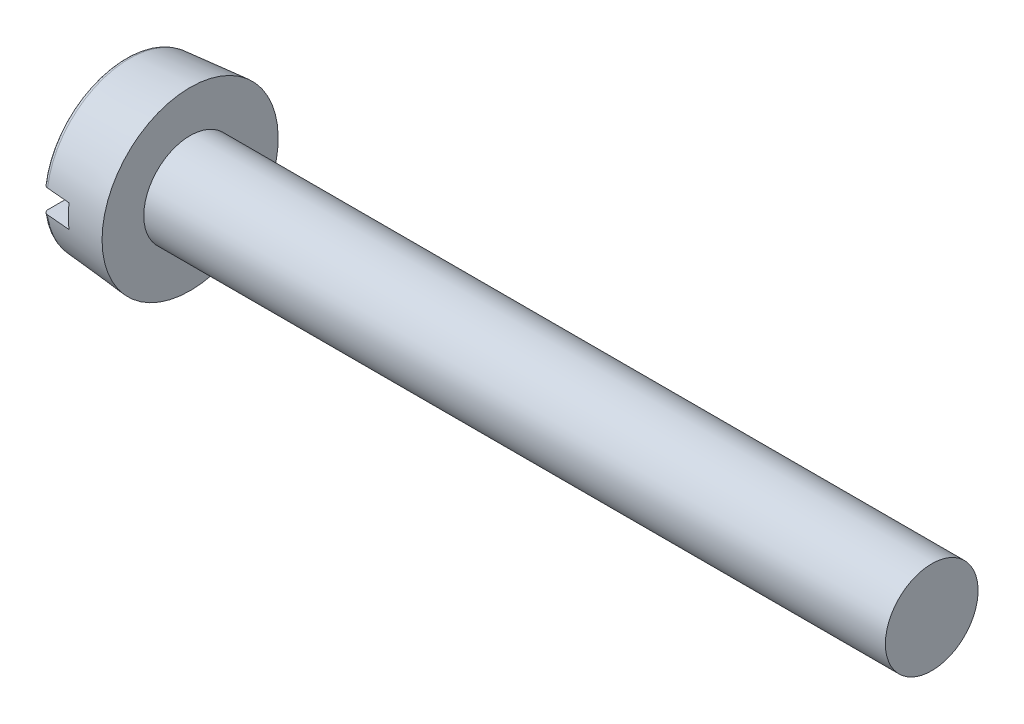
ISO-10303-21;
HEADER;
FILE_DESCRIPTION(('STEP AP214'),'2;1');
FILE_NAME('part.step','',(''),(''),'','','');
FILE_SCHEMA(('AUTOMOTIVE_DESIGN { 1 0 10303 214 1 1 1 1 }'));
ENDSEC;
DATA;
#1=APPLICATION_CONTEXT('core data for automotive mechanical design processes');
#2=APPLICATION_PROTOCOL_DEFINITION('international standard','automotive_design',2000,#1);
#3=PRODUCT_CONTEXT('',#1,'mechanical');
#4=PRODUCT('Part','Part','',(#3));
#5=PRODUCT_RELATED_PRODUCT_CATEGORY('part','',(#4));
#6=PRODUCT_DEFINITION_FORMATION('','',#4);
#7=PRODUCT_DEFINITION_CONTEXT('part definition',#1,'design');
#8=PRODUCT_DEFINITION('design','',#6,#7);
#9=PRODUCT_DEFINITION_SHAPE('','',#8);
#10=(LENGTH_UNIT() NAMED_UNIT(*) SI_UNIT(.MILLI.,.METRE.));
#11=(NAMED_UNIT(*) PLANE_ANGLE_UNIT() SI_UNIT($,.RADIAN.));
#12=(NAMED_UNIT(*) SI_UNIT($,.STERADIAN.) SOLID_ANGLE_UNIT());
#13=UNCERTAINTY_MEASURE_WITH_UNIT(LENGTH_MEASURE(1.E-05),#10,'distance_accuracy_value','');
#14=(GEOMETRIC_REPRESENTATION_CONTEXT(3) GLOBAL_UNCERTAINTY_ASSIGNED_CONTEXT((#13)) GLOBAL_UNIT_ASSIGNED_CONTEXT((#10,
#11,#12)) REPRESENTATION_CONTEXT('',''));
#15=CARTESIAN_POINT('',(0.,0.,0.));
#16=DIRECTION('',(0.,0.,1.));
#17=DIRECTION('',(1.,0.,0.));
#18=AXIS2_PLACEMENT_3D('',#15,#16,#17);
#19=CARTESIAN_POINT('',(0.,0.,0.));
#20=DIRECTION('',(-1.,0.,0.));
#21=DIRECTION('',(0.,0.,1.));
#22=AXIS2_PLACEMENT_3D('',#19,#20,#21);
#23=PLANE('',#22);
#24=DIRECTION('',(0.,0.,-1.));
#25=VECTOR('',#24,1.);
#26=CARTESIAN_POINT('',(0.,0.25,1.9));
#27=LINE('',#26,#25);
#28=CARTESIAN_POINT('',(0.,0.25,1.66724343126457));
#29=VERTEX_POINT('',#28);
#30=CARTESIAN_POINT('',(0.,0.25,-1.66724343126457));
#31=VERTEX_POINT('',#30);
#32=EDGE_CURVE('E103',#29,#31,#27,.T.);
#33=ORIENTED_EDGE('',*,*,#32,.F.);
#34=CARTESIAN_POINT('',(0.,0.,0.));
#35=DIRECTION('',(-1.,0.,0.));
#36=DIRECTION('',(0.,0.,1.));
#37=AXIS2_PLACEMENT_3D('',#34,#35,#36);
#38=CIRCLE('',#37,1.68588275366196);
#39=EDGE_CURVE('E105',#29,#31,#38,.T.);
#40=ORIENTED_EDGE('',*,*,#39,.T.);
#41=EDGE_LOOP('',(#33,#40));
#42=FACE_BOUND('',#41,.T.);
#43=ADVANCED_FACE('F35',(#42),#23,.T.);
#44=CARTESIAN_POINT('',(0.1,0.,0.));
#45=DIRECTION('',(-1.,0.,0.));
#46=DIRECTION('',(0.,0.,1.));
#47=AXIS2_PLACEMENT_3D('',#44,#45,#46);
#48=TOROIDAL_SURFACE('',#47,1.68588275366196,0.1);
#49=CARTESIAN_POINT('',(0.0301239837184526,0.25,-1.73954570987134));
#50=CARTESIAN_POINT('',(0.034112254025655,0.25,-1.74348114703534));
#51=CARTESIAN_POINT('',(0.0384332916495908,0.25,-1.74708479745269));
#52=CARTESIAN_POINT('',(0.047621596888568,0.25,-1.75351988324919));
#53=CARTESIAN_POINT('',(0.0524894518418904,0.25,-1.75635047687334));
#54=CARTESIAN_POINT('',(0.062632126905778,0.25,-1.7611518726827));
#55=CARTESIAN_POINT('',(0.0679068945512788,0.25,-1.76312278549305));
#56=CARTESIAN_POINT('',(0.0787122454713205,0.25,-1.76614517825523));
#57=CARTESIAN_POINT('',(0.0842427666888278,0.25,-1.76719688002821));
#58=CARTESIAN_POINT('',(0.095373394443947,0.25,-1.76834695503076));
#59=CARTESIAN_POINT('',(0.100972999637236,0.25,-1.76845018239128));
#60=CARTESIAN_POINT('',(0.112109811915657,0.25,-1.76771285537891));
#61=CARTESIAN_POINT('',(0.117647018058241,0.25,-1.76687228676909));
#62=CARTESIAN_POINT('',(0.128489803717952,0.25,-1.76427538353904));
#63=CARTESIAN_POINT('',(0.133795848010852,0.25,-1.76252098799906));
#64=CARTESIAN_POINT('',(0.144039730319539,0.25,-1.75814968615088));
#65=CARTESIAN_POINT('',(0.148977564711526,0.25,-1.75553277135543));
#66=CARTESIAN_POINT('',(0.15836674169469,0.25,-1.74950124280131));
#67=CARTESIAN_POINT('',(0.162816088565464,0.25,-1.74608352334629));
#68=CARTESIAN_POINT('',(0.171083921068067,0.25,-1.73855542384798));
#69=CARTESIAN_POINT('',(0.174902382724925,0.25,-1.73444501749311));
#70=CARTESIAN_POINT('',(0.181835504151915,0.25,-1.72561114445745));
#71=CARTESIAN_POINT('',(0.184943867145123,0.25,-1.72088273649891));
#72=CARTESIAN_POINT('',(0.190331805109598,0.25,-1.71097526726483));
#73=CARTESIAN_POINT('',(0.19261133485436,0.25,-1.7057961814165));
#74=CARTESIAN_POINT('',(0.196300503462131,0.25,-1.69507883946751));
#75=CARTESIAN_POINT('',(0.197701208750648,0.25,-1.68953750769915));
#76=CARTESIAN_POINT('',(0.199560107931746,0.25,-1.67829891478366));
#77=CARTESIAN_POINT('',(0.2000182569785,0.25,-1.67260164623029));
#78=CARTESIAN_POINT('',(0.199980488082452,0.25,-1.66116755240173));
#79=CARTESIAN_POINT('',(0.199477416691625,0.25,-1.65543074959807));
#80=CARTESIAN_POINT('',(0.197516883099685,0.25,-1.64412247089109));
#81=CARTESIAN_POINT('',(0.19605940106392,0.25,-1.6385509984262));
#82=CARTESIAN_POINT('',(0.192226434881595,0.25,-1.62772407078967));
#83=CARTESIAN_POINT('',(0.189849634285873,0.25,-1.62246908134511));
#84=CARTESIAN_POINT('',(0.184242507962168,0.25,-1.61243590232117));
#85=CARTESIAN_POINT('',(0.181012200803495,0.25,-1.60765770237164));
#86=CARTESIAN_POINT('',(0.173808398364609,0.25,-1.59874552852762));
#87=CARTESIAN_POINT('',(0.16983941365434,0.25,-1.5946079100141));
#88=CARTESIAN_POINT('',(0.161256212040593,0.25,-1.58706689346002));
#89=CARTESIAN_POINT('',(0.156642033668647,0.25,-1.58366345160461));
#90=CARTESIAN_POINT('',(0.146954193747203,0.25,-1.577728304209));
#91=CARTESIAN_POINT('',(0.141886222152689,0.25,-1.57518731173971));
#92=CARTESIAN_POINT('',(0.131392256265676,0.25,-1.57100326499133));
#93=CARTESIAN_POINT('',(0.125966286684049,0.25,-1.5693601488087));
#94=CARTESIAN_POINT('',(0.114975418023078,0.25,-1.56703614777695));
#95=CARTESIAN_POINT('',(0.109412743361664,0.25,-1.56634473553344));
#96=CARTESIAN_POINT('',(0.0982506296477884,0.25,-1.56591134324024));
#97=CARTESIAN_POINT('',(0.0926511921124149,0.25,-1.56616932425487));
#98=CARTESIAN_POINT('',(0.0816068018037831,0.25,-1.56762261837648));
#99=CARTESIAN_POINT('',(0.0761611699810637,0.25,-1.56881278083001));
#100=CARTESIAN_POINT('',(0.0655461187744446,0.25,-1.57208782392461));
#101=CARTESIAN_POINT('',(0.0603767005480557,0.25,-1.5741727083148));
#102=CARTESIAN_POINT('',(0.0504429211594084,0.25,-1.57918218125947));
#103=CARTESIAN_POINT('',(0.0456798188477843,0.25,-1.58210926476463));
#104=CARTESIAN_POINT('',(0.0367063855830663,0.25,-1.58871421123321));
#105=CARTESIAN_POINT('',(0.0324960808997952,0.25,-1.59239210985535));
#106=CARTESIAN_POINT('',(0.0247028499071559,0.25,-1.60043217731811));
#107=CARTESIAN_POINT('',(0.0211264966781283,0.25,-1.60480071638002));
#108=CARTESIAN_POINT('',(0.0147478039662305,0.25,-1.61407035663433));
#109=CARTESIAN_POINT('',(0.0119455146325412,0.25,-1.61897149230335));
#110=CARTESIAN_POINT('',(0.00716047536747477,0.25,-1.62922901712882));
#111=CARTESIAN_POINT('',(0.00518773010061175,0.25,-1.6345900743117));
#112=CARTESIAN_POINT('',(0.00216211004761502,0.25,-1.64556559292559));
#113=CARTESIAN_POINT('',(0.00110924708522794,0.25,-1.6511800576128));
#114=CARTESIAN_POINT('',(-5.33425649794324E-05,0.25,-1.66255157007252));
#115=CARTESIAN_POINT('',(-0.000155417619311267,0.25,-1.6683094013264));
#116=CARTESIAN_POINT('',(0.000607195995681169,0.25,-1.67976235656453));
#117=CARTESIAN_POINT('',(0.00147213868127235,0.25,-1.68545746367547));
#118=CARTESIAN_POINT('',(0.00414869895477062,0.25,-1.69663068032758));
#119=CARTESIAN_POINT('',(0.00596193608673396,0.25,-1.70210840133309));
#120=CARTESIAN_POINT('',(0.0104866705202582,0.25,-1.71267417663621));
#121=CARTESIAN_POINT('',(0.0131970742616454,0.25,-1.71776269608293));
#122=CARTESIAN_POINT('',(0.0183021368753953,0.25,-1.72564874312836));
#123=CARTESIAN_POINT('',(0.0204534266755831,0.25,-1.72860667972899));
#124=CARTESIAN_POINT('',(0.0250639712199923,0.25,-1.73427200964239));
#125=CARTESIAN_POINT('',(0.0275232249959105,0.25,-1.73697940374288));
#126=CARTESIAN_POINT('',(0.0301239837184526,0.25,-1.73954570987134));
#127=B_SPLINE_CURVE_WITH_KNOTS('',3,(#49,#50,#51,#52,#53,#54,#55,#56,#57,#58,#59,#60,#61,#62,
#63,#64,#65,#66,#67,#68,#69,#70,#71,#72,#73,#74,#75,#76,#77,#78,#79,#80,#81,#82,#83,#84,#85,#86,
#87,#88,#89,#90,#91,#92,#93,#94,#95,#96,#97,#98,#99,#100,#101,#102,#103,#104,#105,#106,#107,
#108,#109,#110,#111,#112,#113,#114,#115,#116,#117,#118,#119,#120,#121,#122,#123,#124,#125,#126),
.UNSPECIFIED.,.T.,.F.,(4,2,2,2,2,2,2,2,2,2,2,2,2,2,2,2,2,2,2,2,2,2,2,2,2,2,2,2,2,2,2,2,2,2,2,2,
2,2,4),(0.,0.0167959110445544,0.0336100383184083,0.0504220012837826,0.067229906117249,
0.0839517427346662,0.100673831600298,0.117360580985524,0.13404749457459,0.150800227323111,
0.16755359656452,0.184450209981753,0.201347745249247,0.21841437976708,0.235481826278521,
0.252676784421207,0.269872099922449,0.287092130544962,0.304311786550839,0.321429553193156,
0.338546297983667,0.355472401973108,0.372397338855157,0.389133511649821,0.405868998082989,
0.422512661437951,0.439156394534986,0.455849950224767,0.472544298931969,0.489402732254282,
0.506262257525773,0.523319657239104,0.540377276197228,0.557572051898691,0.574771345386106,
0.59200010906381,0.609207949388039,0.620160629655461,0.631113275486232),.UNSPECIFIED.);
#128=CARTESIAN_POINT('',(0.0912844257252333,0.25,-1.76791351316188));
#129=VERTEX_POINT('',#128);
#130=EDGE_CURVE('E59',#31,#129,#127,.T.);
#131=ORIENTED_EDGE('',*,*,#130,.F.);
#132=ORIENTED_EDGE('',*,*,#39,.F.);
#133=CARTESIAN_POINT('',(0.038410820052543,0.25,1.58753563015566));
#134=CARTESIAN_POINT('',(0.0427902939890951,0.25,1.58407005650774));
#135=CARTESIAN_POINT('',(0.0474630469549886,0.25,1.58096901798645));
#136=CARTESIAN_POINT('',(0.0572657439915521,0.25,1.57559125576911));
#137=CARTESIAN_POINT('',(0.0623961680717351,0.25,1.57331541051488));
#138=CARTESIAN_POINT('',(0.0729671844638347,0.25,1.56966008382672));
#139=CARTESIAN_POINT('',(0.07840774990333,0.25,1.56828052486143));
#140=CARTESIAN_POINT('',(0.0894424523036424,0.25,1.56646066317196));
#141=CARTESIAN_POINT('',(0.095036552043679,0.25,1.56602013480384));
#142=CARTESIAN_POINT('',(0.106187916851424,0.25,1.56609100566934));
#143=CARTESIAN_POINT('',(0.111745215600338,0.25,1.56659719462549));
#144=CARTESIAN_POINT('',(0.122695887603688,0.25,1.56853573821628));
#145=CARTESIAN_POINT('',(0.128089257112213,0.25,1.56996811399837));
#146=CARTESIAN_POINT('',(0.138558934280524,0.25,1.57371510963342));
#147=CARTESIAN_POINT('',(0.143635299693183,0.25,1.57602956823661));
#148=CARTESIAN_POINT('',(0.153331512379459,0.25,1.58147155156435));
#149=CARTESIAN_POINT('',(0.15795134553212,0.25,1.58459910142768));
#150=CARTESIAN_POINT('',(0.166642844689645,0.25,1.59160307133553));
#151=CARTESIAN_POINT('',(0.170709973240091,0.25,1.59548512047214));
#152=CARTESIAN_POINT('',(0.178144005385512,0.25,1.60386991016736));
#153=CARTESIAN_POINT('',(0.181510868111661,0.25,1.6083726869273));
#154=CARTESIAN_POINT('',(0.18749050008726,0.25,1.61792751523025));
#155=CARTESIAN_POINT('',(0.190093987175765,0.25,1.62298537603827));
#156=CARTESIAN_POINT('',(0.1944245750689,0.25,1.63346332336008));
#157=CARTESIAN_POINT('',(0.196151623655146,0.25,1.63888343143487));
#158=CARTESIAN_POINT('',(0.19869656706418,0.25,1.64999030292115));
#159=CARTESIAN_POINT('',(0.19950519348372,0.25,1.65567919157282));
#160=CARTESIAN_POINT('',(0.200160111365204,0.25,1.66711218979157));
#161=CARTESIAN_POINT('',(0.200006372625093,0.25,1.67285630108606));
#162=CARTESIAN_POINT('',(0.198737358913371,0.25,1.68426056047317));
#163=CARTESIAN_POINT('',(0.197618277112314,0.25,1.68992028578478));
#164=CARTESIAN_POINT('',(0.194442698747917,0.25,1.70097049473464));
#165=CARTESIAN_POINT('',(0.192386209487117,0.25,1.70636098046993));
#166=CARTESIAN_POINT('',(0.187399427297266,0.25,1.7166994325418));
#167=CARTESIAN_POINT('',(0.18447206309478,0.25,1.72164881093218));
#168=CARTESIAN_POINT('',(0.177821112560515,0.25,1.7309802162384));
#169=CARTESIAN_POINT('',(0.174097559800523,0.25,1.73536226706347));
#170=CARTESIAN_POINT('',(0.165993769608675,0.25,1.74339353418511));
#171=CARTESIAN_POINT('',(0.161619482864613,0.25,1.74704875411543));
#172=CARTESIAN_POINT('',(0.152314080979336,0.25,1.75356401214195));
#173=CARTESIAN_POINT('',(0.147382997277304,0.25,1.75642409510351));
#174=CARTESIAN_POINT('',(0.137157313470634,0.25,1.76123793804063));
#175=CARTESIAN_POINT('',(0.131866864335231,0.25,1.76320051691167));
#176=CARTESIAN_POINT('',(0.121030177928266,0.25,1.7662021188539));
#177=CARTESIAN_POINT('',(0.115483952770112,0.25,1.76724118561497));
#178=CARTESIAN_POINT('',(0.10433726421861,0.25,1.76836005573213));
#179=CARTESIAN_POINT('',(0.0987375081693258,0.25,1.76844691644335));
#180=CARTESIAN_POINT('',(0.087603319258539,0.25,1.76767711814466));
#181=CARTESIAN_POINT('',(0.0820688850795545,0.25,1.76682047819726));
#182=CARTESIAN_POINT('',(0.0712339359121825,0.25,1.76419215705386));
#183=CARTESIAN_POINT('',(0.0659329644744124,0.25,1.76242235604695));
#184=CARTESIAN_POINT('',(0.0557017028644443,0.25,1.75802135089928));
#185=CARTESIAN_POINT('',(0.0507714167878425,0.25,1.75539013724272));
#186=CARTESIAN_POINT('',(0.0413993898846341,0.25,1.74933132383135));
#187=CARTESIAN_POINT('',(0.0369596773547098,0.25,1.74590058763537));
#188=CARTESIAN_POINT('',(0.0287131089970532,0.25,1.73834824703872));
#189=CARTESIAN_POINT('',(0.0249062794513212,0.25,1.73422661396116));
#190=CARTESIAN_POINT('',(0.0179981143560025,0.25,1.72537218244404));
#191=CARTESIAN_POINT('',(0.0149031090922604,0.25,1.72063444579746));
#192=CARTESIAN_POINT('',(0.00954325096840232,0.25,1.71071066098417));
#193=CARTESIAN_POINT('',(0.00727844426054883,0.25,1.70552458791341));
#194=CARTESIAN_POINT('',(0.00361981721141317,0.25,1.6947956662052));
#195=CARTESIAN_POINT('',(0.00223495300327892,0.25,1.68924976295691));
#196=CARTESIAN_POINT('',(0.000408375366710347,0.25,1.67800493025775));
#197=CARTESIAN_POINT('',(-3.33291319020889E-05,0.25,1.67230599935852));
#198=CARTESIAN_POINT('',(3.75123327412075E-05,0.25,1.66087218591111));
#199=CARTESIAN_POINT('',(0.000557074784948298,0.25,1.65513734594055));
#200=CARTESIAN_POINT('',(0.00255033342308908,0.25,1.64383422369473));
#201=CARTESIAN_POINT('',(0.00402428246581622,0.25,1.63826598596849));
#202=CARTESIAN_POINT('',(0.0078899997087705,0.25,1.62744650084935));
#203=CARTESIAN_POINT('',(0.0102834602468332,0.25,1.62219585873013));
#204=CARTESIAN_POINT('',(0.0159217046243908,0.25,1.61217899485774));
#205=CARTESIAN_POINT('',(0.019165452268333,0.25,1.607412193218));
#206=CARTESIAN_POINT('',(0.0251008031700794,0.25,1.60011257766084));
#207=CARTESIAN_POINT('',(0.0275686339076144,0.25,1.59739475707804));
#208=CARTESIAN_POINT('',(0.0327857649139937,0.25,1.59224410808593));
#209=CARTESIAN_POINT('',(0.0355350642370449,0.25,1.58981127871903));
#210=CARTESIAN_POINT('',(0.038410820052543,0.25,1.58753563015566));
#211=B_SPLINE_CURVE_WITH_KNOTS('',3,(#133,#134,#135,#136,#137,#138,#139,#140,#141,#142,#143,
#144,#145,#146,#147,#148,#149,#150,#151,#152,#153,#154,#155,#156,#157,#158,#159,#160,#161,#162,
#163,#164,#165,#166,#167,#168,#169,#170,#171,#172,#173,#174,#175,#176,#177,#178,#179,#180,#181,
#182,#183,#184,#185,#186,#187,#188,#189,#190,#191,#192,#193,#194,#195,#196,#197,#198,#199,#200,
#201,#202,#203,#204,#205,#206,#207,#208,#209,#210),.UNSPECIFIED.,.T.,.F.,(4,2,2,2,2,2,2,2,2,2,2,
2,2,2,2,2,2,2,2,2,2,2,2,2,2,2,2,2,2,2,2,2,2,2,2,2,2,2,4),(0.,0.0167411910060397,
0.0335001515260866,0.0502576621545582,0.0670111455902061,0.0836726971117883,0.10033462907698,
0.116993516605719,0.133652919247718,0.150441746179846,0.167231552664634,0.184217767175992,
0.201204993610689,0.218362167205906,0.235519879250063,0.252745563649486,0.269971113860593,
0.287139377595869,0.304306917563326,0.321326154497721,0.338344430931905,0.355191689226128,
0.37203815046139,0.388759667571552,0.405480846845857,0.422167733967673,0.438854805431025,
0.455608474446361,0.472362839024728,0.489260888718256,0.50615987766299,0.523228221442542,
0.540296726824197,0.557490310608039,0.574688451553918,0.591918398070691,0.609127444285943,
0.620120485883896,0.631113490544151),.UNSPECIFIED.);
#212=CARTESIAN_POINT('',(0.0912844257209469,0.25,1.76791351317857));
#213=VERTEX_POINT('',#212);
#214=EDGE_CURVE('E95',#213,#29,#211,.T.);
#215=ORIENTED_EDGE('',*,*,#214,.F.);
#216=CARTESIAN_POINT('',(0.0912844257252333,0.,0.));
#217=DIRECTION('',(-1.,0.,0.));
#218=DIRECTION('',(0.,0.,1.));
#219=AXIS2_PLACEMENT_3D('',#216,#217,#218);
#220=CIRCLE('',#219,1.78550222347114);
#221=EDGE_CURVE('E109',#129,#213,#220,.F.);
#222=ORIENTED_EDGE('',*,*,#221,.F.);
#223=EDGE_LOOP('',(#131,#132,#215,#222));
#224=FACE_BOUND('',#223,.T.);
#225=ADVANCED_FACE('F180',(#224),#48,.T.);
#226=CARTESIAN_POINT('',(-25.4,0.,0.));
#227=DIRECTION('',(-1.,0.,0.));
#228=DIRECTION('',(0.,0.,1.));
#229=AXIS2_PLACEMENT_3D('',#226,#227,#228);
#230=CYLINDRICAL_SURFACE('',#229,1.);
#231=CARTESIAN_POINT('',(17.4,0.,0.));
#232=DIRECTION('',(-1.,0.,0.));
#233=DIRECTION('',(0.,0.,1.));
#234=AXIS2_PLACEMENT_3D('',#231,#232,#233);
#235=CIRCLE('',#234,1.);
#236=CARTESIAN_POINT('',(17.4,0.,1.));
#237=VERTEX_POINT('',#236);
#238=EDGE_CURVE('E106',#237,#237,#235,.T.);
#239=ORIENTED_EDGE('',*,*,#238,.T.);
#240=EDGE_LOOP('',(#239));
#241=FACE_BOUND('',#240,.T.);
#242=CARTESIAN_POINT('',(1.4,0.,0.));
#243=DIRECTION('',(-1.,0.,0.));
#244=DIRECTION('',(0.,0.,1.));
#245=AXIS2_PLACEMENT_3D('',#242,#243,#244);
#246=CIRCLE('',#245,1.);
#247=CARTESIAN_POINT('',(1.4,0.,1.));
#248=VERTEX_POINT('',#247);
#249=EDGE_CURVE('E167',#248,#248,#246,.T.);
#250=ORIENTED_EDGE('',*,*,#249,.F.);
#251=EDGE_LOOP('',(#250));
#252=FACE_BOUND('',#251,.T.);
#253=ADVANCED_FACE('F177',(#241,#252),#230,.T.);
#254=CARTESIAN_POINT('',(17.4,1.,0.));
#255=DIRECTION('',(1.,0.,0.));
#256=DIRECTION('',(0.,0.,-1.));
#257=AXIS2_PLACEMENT_3D('',#254,#255,#256);
#258=PLANE('',#257);
#259=ORIENTED_EDGE('',*,*,#238,.F.);
#260=EDGE_LOOP('',(#259));
#261=FACE_BOUND('',#260,.T.);
#262=ADVANCED_FACE('F179',(#261),#258,.T.);
#263=DIRECTION('',(0.,0.,1.));
#264=VECTOR('',#263,1.);
#265=CARTESIAN_POINT('',(0.,-0.25,-1.9));
#266=LINE('',#265,#264);
#267=CARTESIAN_POINT('',(0.,-0.25,-1.66724343126457));
#268=VERTEX_POINT('',#267);
#269=CARTESIAN_POINT('',(0.,-0.25,1.66724343126457));
#270=VERTEX_POINT('',#269);
#271=EDGE_CURVE('E51',#268,#270,#266,.T.);
#272=ORIENTED_EDGE('',*,*,#271,.F.);
#273=EDGE_CURVE('E101',#268,#270,#38,.T.);
#274=ORIENTED_EDGE('',*,*,#273,.T.);
#275=EDGE_LOOP('',(#272,#274));
#276=FACE_BOUND('',#275,.T.);
#277=ADVANCED_FACE('F100',(#276),#23,.T.);
#278=CARTESIAN_POINT('',(0.,0.,0.));
#279=DIRECTION('',(1.,0.,0.));
#280=DIRECTION('',(0.,0.,-1.));
#281=AXIS2_PLACEMENT_3D('',#278,#279,#280);
#282=CONICAL_SURFACE('',#281,1.77751587106371,0.0872664625997166);
#283=CARTESIAN_POINT('',(3.62107818810661,0.25,2.07934430853245));
#284=CARTESIAN_POINT('',(3.06980125604964,0.25,2.03076587392467));
#285=CARTESIAN_POINT('',(2.51852633750628,0.25,1.98216457470873));
#286=CARTESIAN_POINT('',(1.41598182372261,0.25,1.88490176224617));
#287=CARTESIAN_POINT('',(0.864712228482191,0.25,1.83624024900076));
#288=CARTESIAN_POINT('',(-0.237820369493236,0.25,1.7388425212793));
#289=CARTESIAN_POINT('',(-0.789083372228188,0.25,1.69010630680258));
#290=CARTESIAN_POINT('',(-1.89160065704932,0.25,1.59253521876818));
#291=CARTESIAN_POINT('',(-2.44285493913533,0.25,1.5437003452085));
#292=CARTESIAN_POINT('',(-2.99410378813087,0.25,1.49480416395094));
#293=B_SPLINE_CURVE_WITH_KNOTS('',3,(#283,#284,#285,#286,#287,#288,#289,#290,#291,#292),
.UNSPECIFIED.,.F.,.F.,(4,2,2,2,4),(0.,1.66023946632278,3.32047889930815,4.98071834715392,
6.64095782861457),.UNSPECIFIED.);
#294=CARTESIAN_POINT('',(0.6,0.25,1.8128522259904));
#295=VERTEX_POINT('',#294);
#296=EDGE_CURVE('E158',#295,#213,#293,.T.);
#297=ORIENTED_EDGE('',*,*,#296,.F.);
#298=CARTESIAN_POINT('',(0.6,0.,0.));
#299=DIRECTION('',(1.,0.,0.));
#300=DIRECTION('',(0.,0.,-1.));
#301=AXIS2_PLACEMENT_3D('',#298,#299,#300);
#302=CIRCLE('',#301,1.83000906917926);
#303=CARTESIAN_POINT('',(0.6,-0.25,1.8128522259904));
#304=VERTEX_POINT('',#303);
#305=EDGE_CURVE('E11',#304,#295,#302,.F.);
#306=ORIENTED_EDGE('',*,*,#305,.F.);
#307=CARTESIAN_POINT('',(-2.99410378813087,-0.25,1.49480416395094));
#308=CARTESIAN_POINT('',(-2.06836137178343,-0.25,1.57691372931172));
#309=CARTESIAN_POINT('',(-1.14260434025588,-0.25,1.65885820727604));
#310=CARTESIAN_POINT('',(-0.0400762748424807,-0.25,1.75630736694366));
#311=CARTESIAN_POINT('',(0.136684651711361,-0.25,1.77192637736924));
#312=CARTESIAN_POINT('',(1.41597857948217,-0.25,1.88493859856276));
#313=CARTESIAN_POINT('',(2.51852498766333,-0.25,1.98218009580805));
#314=CARTESIAN_POINT('',(3.62107818810661,-0.25,2.07934430853245));
#315=B_SPLINE_CURVE_WITH_KNOTS('',3,(#307,#308,#309,#310,#311,#312,#313,#314),.UNSPECIFIED.,.F.,
.F.,(4,2,2,4),(0.,2.78812996950874,3.32047892237668,6.64095781673274),.UNSPECIFIED.);
#316=CARTESIAN_POINT('',(0.0912844257252334,-0.25,1.76791351316188));
#317=VERTEX_POINT('',#316);
#318=EDGE_CURVE('E136',#317,#304,#315,.T.);
#319=ORIENTED_EDGE('',*,*,#318,.F.);
#320=CARTESIAN_POINT('',(0.091284425720508,-0.25,-1.76791351318017));
#321=VERTEX_POINT('',#320);
#322=EDGE_CURVE('E115',#317,#321,#220,.F.);
#323=ORIENTED_EDGE('',*,*,#322,.T.);
#324=CARTESIAN_POINT('',(3.62107818810661,-0.25,-2.07934430853245));
#325=CARTESIAN_POINT('',(3.06980125604964,-0.25,-2.03076587392467));
#326=CARTESIAN_POINT('',(2.51852633750628,-0.25,-1.98216457470873));
#327=CARTESIAN_POINT('',(1.41598182372261,-0.25,-1.88490176224617));
#328=CARTESIAN_POINT('',(0.864712228482191,-0.25,-1.83624024900076));
#329=CARTESIAN_POINT('',(-0.237820369493236,-0.25,-1.7388425212793));
#330=CARTESIAN_POINT('',(-0.789083372228188,-0.25,-1.69010630680258));
#331=CARTESIAN_POINT('',(-1.89160065704932,-0.25,-1.59253521876818));
#332=CARTESIAN_POINT('',(-2.44285493913533,-0.25,-1.5437003452085));
#333=CARTESIAN_POINT('',(-2.99410378813087,-0.25,-1.49480416395094));
#334=B_SPLINE_CURVE_WITH_KNOTS('',3,(#324,#325,#326,#327,#328,#329,#330,#331,#332,#333),
.UNSPECIFIED.,.F.,.F.,(4,2,2,2,4),(0.,1.66023946632278,3.32047889930815,4.98071834715392,
6.64095782861457),.UNSPECIFIED.);
#335=CARTESIAN_POINT('',(0.6,-0.25,-1.8128522259904));
#336=VERTEX_POINT('',#335);
#337=EDGE_CURVE('E90',#336,#321,#334,.T.);
#338=ORIENTED_EDGE('',*,*,#337,.F.);
#339=CARTESIAN_POINT('',(0.6,0.25,-1.8128522259904));
#340=VERTEX_POINT('',#339);
#341=EDGE_CURVE('E40',#340,#336,#302,.F.);
#342=ORIENTED_EDGE('',*,*,#341,.F.);
#343=CARTESIAN_POINT('',(-2.99410378813087,0.25,-1.49480416395094));
#344=CARTESIAN_POINT('',(-2.06836137178343,0.25,-1.57691372931172));
#345=CARTESIAN_POINT('',(-1.14260434025588,0.25,-1.65885820727604));
#346=CARTESIAN_POINT('',(-0.0400762748424807,0.25,-1.75630736694366));
#347=CARTESIAN_POINT('',(0.136684651711361,0.25,-1.77192637736924));
#348=CARTESIAN_POINT('',(1.41597857948217,0.25,-1.88493859856276));
#349=CARTESIAN_POINT('',(2.51852498766333,0.25,-1.98218009580805));
#350=CARTESIAN_POINT('',(3.62107818810661,0.25,-2.07934430853245));
#351=B_SPLINE_CURVE_WITH_KNOTS('',3,(#343,#344,#345,#346,#347,#348,#349,#350),.UNSPECIFIED.,.F.,
.F.,(4,2,2,4),(0.,2.78812996950874,3.32047892237668,6.64095781673274),.UNSPECIFIED.);
#352=EDGE_CURVE('E162',#129,#340,#351,.T.);
#353=ORIENTED_EDGE('',*,*,#352,.F.);
#354=ORIENTED_EDGE('',*,*,#221,.T.);
#355=EDGE_LOOP('',(#297,#306,#319,#323,#338,#342,#353,#354));
#356=FACE_BOUND('',#355,.T.);
#357=CARTESIAN_POINT('',(1.4,0.,0.));
#358=DIRECTION('',(-1.,0.,0.));
#359=DIRECTION('',(0.,0.,1.));
#360=AXIS2_PLACEMENT_3D('',#357,#358,#359);
#361=CIRCLE('',#360,1.9);
#362=CARTESIAN_POINT('',(1.4,0.,1.9));
#363=VERTEX_POINT('',#362);
#364=EDGE_CURVE('E111',#363,#363,#361,.T.);
#365=ORIENTED_EDGE('',*,*,#364,.T.);
#366=EDGE_LOOP('',(#365));
#367=FACE_BOUND('',#366,.T.);
#368=ADVANCED_FACE('F147',(#356,#367),#282,.T.);
#369=CARTESIAN_POINT('',(1.4,1.,0.));
#370=DIRECTION('',(-1.,0.,0.));
#371=DIRECTION('',(0.,0.,1.));
#372=AXIS2_PLACEMENT_3D('',#369,#370,#371);
#373=PLANE('',#372);
#374=ORIENTED_EDGE('',*,*,#364,.F.);
#375=EDGE_LOOP('',(#374));
#376=FACE_BOUND('',#375,.T.);
#377=ORIENTED_EDGE('',*,*,#249,.T.);
#378=EDGE_LOOP('',(#377));
#379=FACE_BOUND('',#378,.T.);
#380=ADVANCED_FACE('F151',(#376,#379),#373,.F.);
#381=CARTESIAN_POINT('',(0.0301239837184526,-0.25,-1.73954570987134));
#382=CARTESIAN_POINT('',(0.0260780259282709,-0.25,-1.7355526396478));
#383=CARTESIAN_POINT('',(0.0223687128122036,-0.25,-1.73121218004398));
#384=CARTESIAN_POINT('',(0.0157302639131425,-0.25,-1.72196511132148));
#385=CARTESIAN_POINT('',(0.0128021718532188,-0.25,-1.71705775723464));
#386=CARTESIAN_POINT('',(0.00781155963394486,-0.25,-1.70682606234138));
#387=CARTESIAN_POINT('',(0.00574827888609278,-0.25,-1.70150209285375));
#388=CARTESIAN_POINT('',(0.00253890332468147,-0.25,-1.69058637396543));
#389=CARTESIAN_POINT('',(0.00139257748788441,-0.25,-1.68499469239027));
#390=CARTESIAN_POINT('',(4.10282908944267E-05,-0.25,-1.6736612271434));
#391=CARTESIAN_POINT('',(-0.0001579375159541,-0.25,-1.66791869666335));
#392=CARTESIAN_POINT('',(0.000406868333239589,-0.25,-1.65648081813977));
#393=CARTESIAN_POINT('',(0.00117071281055949,-0.25,-1.6507854736979));
#394=CARTESIAN_POINT('',(0.00364543682274058,-0.25,-1.63958072861034));
#395=CARTESIAN_POINT('',(0.00536002222944712,-0.25,-1.63407214566351));
#396=CARTESIAN_POINT('',(0.00969258991345446,-0.25,-1.62342232819609));
#397=CARTESIAN_POINT('',(0.0123105654239295,-0.25,-1.61828109092426));
#398=CARTESIAN_POINT('',(0.018368687145406,-0.25,-1.60853152324288));
#399=CARTESIAN_POINT('',(0.021806099864217,-0.25,-1.60392149509216));
#400=CARTESIAN_POINT('',(0.0294130618130889,-0.25,-1.59535108561564));
#401=CARTESIAN_POINT('',(0.0335825743199985,-0.25,-1.59139067172354));
#402=CARTESIAN_POINT('',(0.0424928099447959,-0.25,-1.58427405023075));
#403=CARTESIAN_POINT('',(0.0472275909660962,-0.25,-1.58111040437777));
#404=CARTESIAN_POINT('',(0.0571661220583323,-0.25,-1.57563408783813));
#405=CARTESIAN_POINT('',(0.0623698398595655,-0.25,-1.57332135865154));
#406=CARTESIAN_POINT('',(0.0730321903589693,-0.25,-1.56964075335714));
#407=CARTESIAN_POINT('',(0.0784870693494757,-0.25,-1.5682620002125));
#408=CARTESIAN_POINT('',(0.0895514615468668,-0.25,-1.56644822093411));
#409=CARTESIAN_POINT('',(0.0951609661760001,-0.25,-1.56601314255693));
#410=CARTESIAN_POINT('',(0.106327002489757,-0.25,-1.56609980469677));
#411=CARTESIAN_POINT('',(0.111883595726444,-0.25,-1.56661383635248));
#412=CARTESIAN_POINT('',(0.122831388816505,-0.25,-1.56856777941325));
#413=CARTESIAN_POINT('',(0.128222590680128,-0.25,-1.57000767956016));
#414=CARTESIAN_POINT('',(0.138686958017419,-0.25,-1.57376928649222));
#415=CARTESIAN_POINT('',(0.143760167134578,-0.25,-1.57609087195876));
#416=CARTESIAN_POINT('',(0.153448951544549,-0.25,-1.58154646534634));
#417=CARTESIAN_POINT('',(0.158064511721778,-0.25,-1.58468050008924));
#418=CARTESIAN_POINT('',(0.166746542197497,-0.25,-1.59169675607619));
#419=CARTESIAN_POINT('',(0.170808452559137,-0.25,-1.59558461824979));
#420=CARTESIAN_POINT('',(0.178231167530174,-0.25,-1.60398009132926));
#421=CARTESIAN_POINT('',(0.181591930079707,-0.25,-1.60848773938744));
#422=CARTESIAN_POINT('',(0.187558577382552,-0.25,-1.61805131058344));
#423=CARTESIAN_POINT('',(0.190155167963793,-0.25,-1.62311303257518));
#424=CARTESIAN_POINT('',(0.194471398021903,-0.25,-1.63359750325318));
#425=CARTESIAN_POINT('',(0.196190986225804,-0.25,-1.63902027302674));
#426=CARTESIAN_POINT('',(0.198720541525037,-0.25,-1.6501311220685));
#427=CARTESIAN_POINT('',(0.199521253042963,-0.25,-1.65582131006132));
#428=CARTESIAN_POINT('',(0.200160205109374,-0.25,-1.66725556951255));
#429=CARTESIAN_POINT('',(0.199998414852101,-0.25,-1.67299964268973));
#430=CARTESIAN_POINT('',(0.198713360352002,-0.25,-1.68440229675822));
#431=CARTESIAN_POINT('',(0.197586318442357,-0.25,-1.6900604527342));
#432=CARTESIAN_POINT('',(0.194395171653612,-0.25,-1.70110618713494));
#433=CARTESIAN_POINT('',(0.192331075364088,-0.25,-1.70649376803945));
#434=CARTESIAN_POINT('',(0.187329743049282,-0.25,-1.71682501034087));
#435=CARTESIAN_POINT('',(0.184395458897692,-0.25,-1.7217701001031));
#436=CARTESIAN_POINT('',(0.177731477244738,-0.25,-1.73109181693493));
#437=CARTESIAN_POINT('',(0.174001811840985,-0.25,-1.73546846693245));
#438=CARTESIAN_POINT('',(0.16588691119851,-0.25,-1.74348794106844));
#439=CARTESIAN_POINT('',(0.161507629441039,-0.25,-1.74713678874591));
#440=CARTESIAN_POINT('',(0.152193383444686,-0.25,-1.75363855606621));
#441=CARTESIAN_POINT('',(0.147258449475751,-0.25,-1.75649151903657));
#442=CARTESIAN_POINT('',(0.137026259848382,-0.25,-1.76129070832175));
#443=CARTESIAN_POINT('',(0.131733133431451,-0.25,-1.76324573979348));
#444=CARTESIAN_POINT('',(0.120892616958677,-0.25,-1.76623183391573));
#445=CARTESIAN_POINT('',(0.11534524913605,-0.25,-1.76726297719811));
#446=CARTESIAN_POINT('',(0.104198164295004,-0.25,-1.76836600998605));
#447=CARTESIAN_POINT('',(0.0985991525060395,-0.25,-1.76844503986814));
#448=CARTESIAN_POINT('',(0.0874662076269176,-0.25,-1.76765975687259));
#449=CARTESIAN_POINT('',(0.0819322899786183,-0.25,-1.76679522454642));
#450=CARTESIAN_POINT('',(0.0710974014185309,-0.25,-1.76415096656149));
#451=CARTESIAN_POINT('',(0.0657960842145958,-0.25,-1.76237265523513));
#452=CARTESIAN_POINT('',(0.0555703957728278,-0.25,-1.75795545669432));
#453=CARTESIAN_POINT('',(0.0506455770568968,-0.25,-1.75531761132611));
#454=CARTESIAN_POINT('',(0.0431273776562807,-0.25,-1.75044285417604));
#455=CARTESIAN_POINT('',(0.040372795188405,-0.25,-1.74844968976037));
#456=CARTESIAN_POINT('',(0.0350800601103007,-0.25,-1.74419427547474));
#457=CARTESIAN_POINT('',(0.0325419067549643,-0.25,-1.74193202653123));
#458=CARTESIAN_POINT('',(0.0301239837184526,-0.25,-1.73954570987134));
#459=B_SPLINE_CURVE_WITH_KNOTS('',3,(#381,#382,#383,#384,#385,#386,#387,#388,#389,#390,#391,
#392,#393,#394,#395,#396,#397,#398,#399,#400,#401,#402,#403,#404,#405,#406,#407,#408,#409,#410,
#411,#412,#413,#414,#415,#416,#417,#418,#419,#420,#421,#422,#423,#424,#425,#426,#427,#428,#429,
#430,#431,#432,#433,#434,#435,#436,#437,#438,#439,#440,#441,#442,#443,#444,#445,#446,#447,#448,
#449,#450,#451,#452,#453,#454,#455,#456,#457,#458),.UNSPECIFIED.,.T.,.F.,(4,2,2,2,2,2,2,2,2,2,2,
2,2,2,2,2,2,2,2,2,2,2,2,2,2,2,2,2,2,2,2,2,2,2,2,2,2,2,4),(0.,0.0170411722438939,
0.0341049990186796,0.0511537867645733,0.0681982777803319,0.0853551972527309,0.102513414450954,
0.119738987255988,0.136964431036009,0.154133198727651,0.17130110545575,0.188302245400992,
0.205302216311466,0.222100636581184,0.238898126838039,0.25555978426519,0.272221239097884,
0.288880402169165,0.305540115289019,0.322329672912014,0.339120237403425,0.356107292735505,
0.373095341083041,0.390253043299335,0.407411294666675,0.424637006068489,0.441862559572752,
0.459030335786743,0.476197419326211,0.493215918450514,0.510233490915956,0.527080425228571,
0.543925889090265,0.560644941023429,0.577367882210948,0.594065017517698,0.610741988948958,
0.620926075619136,0.631110127226808),.UNSPECIFIED.);
#460=EDGE_CURVE('E86',#321,#268,#459,.T.);
#461=ORIENTED_EDGE('',*,*,#460,.F.);
#462=ORIENTED_EDGE('',*,*,#322,.F.);
#463=CARTESIAN_POINT('',(0.0384108200525428,-0.25,1.58753563015566));
#464=CARTESIAN_POINT('',(0.0339573950704059,-0.25,1.5910603658954));
#465=CARTESIAN_POINT('',(0.029800799942917,-0.25,1.59496730933873));
#466=CARTESIAN_POINT('',(0.0222010182064333,-0.25,1.60342863634491));
#467=CARTESIAN_POINT('',(0.0187588035663528,-0.25,1.60798388796708));
#468=CARTESIAN_POINT('',(0.0126884755380015,-0.25,1.61760223594505));
#469=CARTESIAN_POINT('',(0.0100595998475481,-0.25,1.62266485084517));
#470=CARTESIAN_POINT('',(0.00568272388268354,-0.25,1.63315559353335));
#471=CARTESIAN_POINT('',(0.0039344989316743,-0.25,1.63858362769256));
#472=CARTESIAN_POINT('',(0.00135420896618537,-0.25,1.6496959787203));
#473=CARTESIAN_POINT('',(0.000529062493142384,-0.25,1.65538190290297));
#474=CARTESIAN_POINT('',(-0.000159268616023203,-0.25,1.66681204026049));
#475=CARTESIAN_POINT('',(-2.23806129213034E-05,-0.25,1.67255625780414));
#476=CARTESIAN_POINT('',(0.00121306917338677,-0.25,1.68396387537009));
#477=CARTESIAN_POINT('',(0.0023154907130275,-0.25,1.68962685820058));
#478=CARTESIAN_POINT('',(0.00545847496257983,-0.25,1.70068635267493));
#479=CARTESIAN_POINT('',(0.00749902870568369,-0.25,1.70608286686519));
#480=CARTESIAN_POINT('',(0.0124553209196926,-0.25,1.71643631844882));
#481=CARTESIAN_POINT('',(0.0153681805259015,-0.25,1.72139463336573));
#482=CARTESIAN_POINT('',(0.0219918139097583,-0.25,1.73074625136145));
#483=CARTESIAN_POINT('',(0.0257025525730674,-0.25,1.73513957929153));
#484=CARTESIAN_POINT('',(0.0337830293566341,-0.25,1.7431954661646));
#485=CARTESIAN_POINT('',(0.0381468204499068,-0.25,1.74686398949027));
#486=CARTESIAN_POINT('',(0.0474336489372385,-0.25,1.7534074422751));
#487=CARTESIAN_POINT('',(0.0523566554179295,-0.25,1.75628241557152));
#488=CARTESIAN_POINT('',(0.062568882579993,-0.25,1.76112700539213));
#489=CARTESIAN_POINT('',(0.0678539229214086,-0.25,1.76310543520284));
#490=CARTESIAN_POINT('',(0.0786825580230994,-0.25,1.76613938813517));
#491=CARTESIAN_POINT('',(0.0842261404099094,-0.25,1.76719495537608));
#492=CARTESIAN_POINT('',(0.0953701815790082,-0.25,1.76834682813952));
#493=CARTESIAN_POINT('',(0.100969908426044,-0.25,1.76845022511559));
#494=CARTESIAN_POINT('',(0.112106813064689,-0.25,1.76771321576232));
#495=CARTESIAN_POINT('',(0.117643992150452,-0.25,1.76687282899673));
#496=CARTESIAN_POINT('',(0.128486801349998,-0.25,1.76427628463559));
#497=CARTESIAN_POINT('',(0.133792894145407,-0.25,1.76252205760683));
#498=CARTESIAN_POINT('',(0.144036912707969,-0.25,1.75815107926835));
#499=CARTESIAN_POINT('',(0.148974834149097,-0.25,1.75553431782577));
#500=CARTESIAN_POINT('',(0.15836419767094,-0.25,1.74950308538222));
#501=CARTESIAN_POINT('',(0.162813645288571,-0.25,1.74608551042966));
#502=CARTESIAN_POINT('',(0.171081709116823,-0.25,1.73855767538295));
#503=CARTESIAN_POINT('',(0.174900300331172,-0.25,1.73444738785466));
#504=CARTESIAN_POINT('',(0.18183369697909,-0.25,1.72561373225442));
#505=CARTESIAN_POINT('',(0.184942206210862,-0.25,1.72088542303857));
#506=CARTESIAN_POINT('',(0.190330447701009,-0.25,1.7109781307854));
#507=CARTESIAN_POINT('',(0.192610135624697,-0.25,1.70579912365806));
#508=CARTESIAN_POINT('',(0.19629963411489,-0.25,1.69508191169097));
#509=CARTESIAN_POINT('',(0.197700511048479,-0.25,1.68954063085116));
#510=CARTESIAN_POINT('',(0.199559761114849,-0.25,1.67830210616433));
#511=CARTESIAN_POINT('',(0.200018088664459,-0.25,1.67260485478783));
#512=CARTESIAN_POINT('',(0.19998067881951,-0.25,1.66117076172758));
#513=CARTESIAN_POINT('',(0.199477787367227,-0.25,1.65543394229265));
#514=CARTESIAN_POINT('',(0.197517609613423,-0.25,1.64412560727951));
#515=CARTESIAN_POINT('',(0.19606030463383,-0.25,1.63855409493864));
#516=CARTESIAN_POINT('',(0.192227684515839,-0.25,1.62772705594972));
#517=CARTESIAN_POINT('',(0.189851052632653,-0.25,1.62247199508646));
#518=CARTESIAN_POINT('',(0.184244245083918,-0.25,1.6124386350999));
#519=CARTESIAN_POINT('',(0.181014086328863,-0.25,1.60766032653354));
#520=CARTESIAN_POINT('',(0.173810564074661,-0.25,1.59874791823183));
#521=CARTESIAN_POINT('',(0.169841712242575,-0.25,1.59461017322819));
#522=CARTESIAN_POINT('',(0.161258744744242,-0.25,1.58706887510163));
#523=CARTESIAN_POINT('',(0.156644666353808,-0.25,1.58366527959454));
#524=CARTESIAN_POINT('',(0.146956906135104,-0.25,1.57772975331653));
#525=CARTESIAN_POINT('',(0.141888904809587,-0.25,1.57518855169054));
#526=CARTESIAN_POINT('',(0.131395039843866,-0.25,1.57100420461337));
#527=CARTESIAN_POINT('',(0.125969215308606,-0.25,1.5693609612099));
#528=CARTESIAN_POINT('',(0.114979237434394,-0.25,1.56703676449653));
#529=CARTESIAN_POINT('',(0.109417329315998,-0.25,1.56634518516968));
#530=CARTESIAN_POINT('',(0.0982551532904772,-0.25,1.56591124754994));
#531=CARTESIAN_POINT('',(0.0926548774749354,-0.25,1.56616909121188));
#532=CARTESIAN_POINT('',(0.081606644355173,-0.25,1.56762238853903));
#533=CARTESIAN_POINT('',(0.0761580649375367,-0.25,1.5688131425548));
#534=CARTESIAN_POINT('',(0.0655421563582805,-0.25,1.57208964252859));
#535=CARTESIAN_POINT('',(0.0603744926639948,-0.25,1.57417429644248));
#536=CARTESIAN_POINT('',(0.0524104046253594,-0.25,1.57818971720466));
#537=CARTESIAN_POINT('',(0.0494794583378909,-0.25,1.57985966161506));
#538=CARTESIAN_POINT('',(0.0438011029424251,-0.25,1.583486746576));
#539=CARTESIAN_POINT('',(0.0410536927850414,-0.25,1.58544388548427));
#540=CARTESIAN_POINT('',(0.0384108200525428,-0.25,1.58753563015566));
#541=B_SPLINE_CURVE_WITH_KNOTS('',3,(#463,#464,#465,#466,#467,#468,#469,#470,#471,#472,#473,
#474,#475,#476,#477,#478,#479,#480,#481,#482,#483,#484,#485,#486,#487,#488,#489,#490,#491,#492,
#493,#494,#495,#496,#497,#498,#499,#500,#501,#502,#503,#504,#505,#506,#507,#508,#509,#510,#511,
#512,#513,#514,#515,#516,#517,#518,#519,#520,#521,#522,#523,#524,#525,#526,#527,#528,#529,#530,
#531,#532,#533,#534,#535,#536,#537,#538,#539,#540),.UNSPECIFIED.,.T.,.F.,(4,2,2,2,2,2,2,2,2,2,2,
2,2,2,2,2,2,2,2,2,2,2,2,2,2,2,2,2,2,2,2,2,2,2,2,2,2,2,4),(0.,0.0170260326836833,
0.0340750808686447,0.0511081010790944,0.0681367735254192,0.0852922394400297,0.102449000706479,
0.119674661423913,0.136900157499331,0.154069419429614,0.171237925902129,0.188258660059426,
0.2052784537698,0.2221271015527,0.238974943808383,0.255697206422081,0.272419122405356,
0.289105854300129,0.305792782233615,0.322545490967143,0.33929886333009,0.356195470160691,
0.373092980678955,0.390159593483887,0.407227031637652,0.424421992283971,0.441617289449299,
0.458837307047765,0.476056983500326,0.493174748345185,0.510291524676525,0.527217987985618,
0.544142604530748,0.560876668671793,0.577614292575123,0.594268136617214,0.610901692986447,
0.621005802745754,0.631109854728851),.UNSPECIFIED.);
#542=EDGE_CURVE('E96',#270,#317,#541,.T.);
#543=ORIENTED_EDGE('',*,*,#542,.F.);
#544=ORIENTED_EDGE('',*,*,#273,.F.);
#545=EDGE_LOOP('',(#461,#462,#543,#544));
#546=FACE_BOUND('',#545,.T.);
#547=ADVANCED_FACE('F37',(#546),#48,.T.);
#548=CARTESIAN_POINT('',(0.6,0.25,1.9));
#549=DIRECTION('',(0.,1.,0.));
#550=DIRECTION('',(0.,0.,1.));
#551=AXIS2_PLACEMENT_3D('',#548,#549,#550);
#552=PLANE('',#551);
#553=ORIENTED_EDGE('',*,*,#352,.T.);
#554=DIRECTION('',(0.,0.,-1.));
#555=VECTOR('',#554,1.);
#556=CARTESIAN_POINT('',(0.6,0.25,1.9));
#557=LINE('',#556,#555);
#558=EDGE_CURVE('E102',#295,#340,#557,.T.);
#559=ORIENTED_EDGE('',*,*,#558,.F.);
#560=ORIENTED_EDGE('',*,*,#296,.T.);
#561=ORIENTED_EDGE('',*,*,#214,.T.);
#562=ORIENTED_EDGE('',*,*,#32,.T.);
#563=ORIENTED_EDGE('',*,*,#130,.T.);
#564=EDGE_LOOP('',(#553,#559,#560,#561,#562,#563));
#565=FACE_BOUND('',#564,.T.);
#566=ADVANCED_FACE('F128',(#565),#552,.F.);
#567=CARTESIAN_POINT('',(0.6,-0.25,-1.9));
#568=DIRECTION('',(0.,-1.,0.));
#569=DIRECTION('',(0.,0.,-1.));
#570=AXIS2_PLACEMENT_3D('',#567,#568,#569);
#571=PLANE('',#570);
#572=ORIENTED_EDGE('',*,*,#337,.T.);
#573=ORIENTED_EDGE('',*,*,#460,.T.);
#574=ORIENTED_EDGE('',*,*,#271,.T.);
#575=ORIENTED_EDGE('',*,*,#542,.T.);
#576=ORIENTED_EDGE('',*,*,#318,.T.);
#577=DIRECTION('',(0.,0.,1.));
#578=VECTOR('',#577,1.);
#579=CARTESIAN_POINT('',(0.6,-0.25,-1.9));
#580=LINE('',#579,#578);
#581=EDGE_CURVE('E141',#336,#304,#580,.T.);
#582=ORIENTED_EDGE('',*,*,#581,.F.);
#583=EDGE_LOOP('',(#572,#573,#574,#575,#576,#582));
#584=FACE_BOUND('',#583,.T.);
#585=ADVANCED_FACE('F87',(#584),#571,.F.);
#586=CARTESIAN_POINT('',(0.6,-0.25,-1.9));
#587=DIRECTION('',(1.,0.,0.));
#588=DIRECTION('',(0.,0.,-1.));
#589=AXIS2_PLACEMENT_3D('',#586,#587,#588);
#590=PLANE('',#589);
#591=ORIENTED_EDGE('',*,*,#305,.T.);
#592=ORIENTED_EDGE('',*,*,#558,.T.);
#593=ORIENTED_EDGE('',*,*,#341,.T.);
#594=ORIENTED_EDGE('',*,*,#581,.T.);
#595=EDGE_LOOP('',(#591,#592,#593,#594));
#596=FACE_BOUND('',#595,.T.);
#597=ADVANCED_FACE('F127',(#596),#590,.F.);
#598=CLOSED_SHELL('',(#43,#225,#253,#262,#277,#368,#380,#547,#566,#585,#597));
#599=MANIFOLD_SOLID_BREP('B2',#598);
#600=ADVANCED_BREP_SHAPE_REPRESENTATION('',(#18,#599),#14);
#601=SHAPE_DEFINITION_REPRESENTATION(#9,#600);
ENDSEC;
END-ISO-10303-21;
